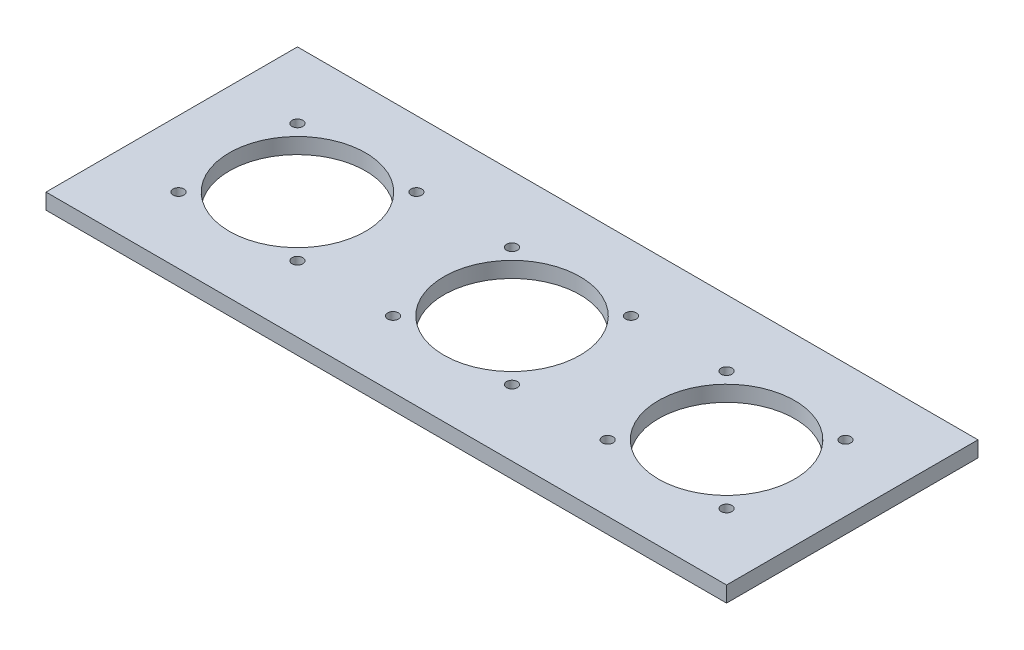
ISO-10303-21;
HEADER;
FILE_DESCRIPTION(('STEP AP214'),'2;1');
FILE_NAME('part.step','',(''),(''),'','','');
FILE_SCHEMA(('AUTOMOTIVE_DESIGN { 1 0 10303 214 1 1 1 1 }'));
ENDSEC;
DATA;
#1=APPLICATION_CONTEXT('core data for automotive mechanical design processes');
#2=APPLICATION_PROTOCOL_DEFINITION('international standard','automotive_design',2000,#1);
#3=PRODUCT_CONTEXT('',#1,'mechanical');
#4=PRODUCT('Part','Part','',(#3));
#5=PRODUCT_RELATED_PRODUCT_CATEGORY('part','',(#4));
#6=PRODUCT_DEFINITION_FORMATION('','',#4);
#7=PRODUCT_DEFINITION_CONTEXT('part definition',#1,'design');
#8=PRODUCT_DEFINITION('design','',#6,#7);
#9=PRODUCT_DEFINITION_SHAPE('','',#8);
#10=(LENGTH_UNIT() NAMED_UNIT(*) SI_UNIT(.MILLI.,.METRE.));
#11=(NAMED_UNIT(*) PLANE_ANGLE_UNIT() SI_UNIT($,.RADIAN.));
#12=(NAMED_UNIT(*) SI_UNIT($,.STERADIAN.) SOLID_ANGLE_UNIT());
#13=UNCERTAINTY_MEASURE_WITH_UNIT(LENGTH_MEASURE(1.E-05),#10,'distance_accuracy_value','');
#14=(GEOMETRIC_REPRESENTATION_CONTEXT(3) GLOBAL_UNCERTAINTY_ASSIGNED_CONTEXT((#13)) GLOBAL_UNIT_ASSIGNED_CONTEXT((#10,
#11,#12)) REPRESENTATION_CONTEXT('',''));
#15=CARTESIAN_POINT('',(0.,0.,0.));
#16=DIRECTION('',(0.,0.,1.));
#17=DIRECTION('',(1.,0.,0.));
#18=AXIS2_PLACEMENT_3D('',#15,#16,#17);
#19=CARTESIAN_POINT('',(206.248,4.7625,76.2));
#20=DIRECTION('',(-1.,0.,0.));
#21=DIRECTION('',(0.,0.,1.));
#22=AXIS2_PLACEMENT_3D('',#19,#20,#21);
#23=PLANE('',#22);
#24=DIRECTION('',(0.,0.,-1.));
#25=VECTOR('',#24,1.);
#26=CARTESIAN_POINT('',(206.248,-4.7625,76.2));
#27=LINE('',#26,#25);
#28=CARTESIAN_POINT('',(206.248,-4.7625,76.2));
#29=VERTEX_POINT('',#28);
#30=CARTESIAN_POINT('',(206.248,-4.7625,-76.2));
#31=VERTEX_POINT('',#30);
#32=EDGE_CURVE('E104',#29,#31,#27,.T.);
#33=ORIENTED_EDGE('',*,*,#32,.T.);
#34=DIRECTION('',(0.,-1.,0.));
#35=VECTOR('',#34,1.);
#36=CARTESIAN_POINT('',(206.248,4.7625,-76.2));
#37=LINE('',#36,#35);
#38=CARTESIAN_POINT('',(206.248,4.7625,-76.2));
#39=VERTEX_POINT('',#38);
#40=EDGE_CURVE('E11',#39,#31,#37,.T.);
#41=ORIENTED_EDGE('',*,*,#40,.F.);
#42=DIRECTION('',(0.,0.,-1.));
#43=VECTOR('',#42,1.);
#44=CARTESIAN_POINT('',(206.248,4.7625,76.2));
#45=LINE('',#44,#43);
#46=CARTESIAN_POINT('',(206.248,4.7625,76.2));
#47=VERTEX_POINT('',#46);
#48=EDGE_CURVE('E92',#47,#39,#45,.T.);
#49=ORIENTED_EDGE('',*,*,#48,.F.);
#50=DIRECTION('',(0.,-1.,0.));
#51=VECTOR('',#50,1.);
#52=CARTESIAN_POINT('',(206.248,4.7625,76.2));
#53=LINE('',#52,#51);
#54=EDGE_CURVE('E100',#47,#29,#53,.T.);
#55=ORIENTED_EDGE('',*,*,#54,.T.);
#56=EDGE_LOOP('',(#33,#41,#49,#55));
#57=FACE_BOUND('',#56,.T.);
#58=ADVANCED_FACE('F41',(#57),#23,.F.);
#59=CARTESIAN_POINT('',(-206.248,4.7625,-76.2));
#60=DIRECTION('',(0.,0.,1.));
#61=DIRECTION('',(1.,0.,0.));
#62=AXIS2_PLACEMENT_3D('',#59,#60,#61);
#63=PLANE('',#62);
#64=DIRECTION('',(-1.,0.,0.));
#65=VECTOR('',#64,1.);
#66=CARTESIAN_POINT('',(-206.248,-4.7625,-76.2));
#67=LINE('',#66,#65);
#68=CARTESIAN_POINT('',(-206.248,-4.7625,-76.2));
#69=VERTEX_POINT('',#68);
#70=EDGE_CURVE('E96',#31,#69,#67,.T.);
#71=ORIENTED_EDGE('',*,*,#70,.T.);
#72=DIRECTION('',(0.,-1.,0.));
#73=VECTOR('',#72,1.);
#74=CARTESIAN_POINT('',(-206.248,4.7625,-76.2));
#75=LINE('',#74,#73);
#76=CARTESIAN_POINT('',(-206.248,4.7625,-76.2));
#77=VERTEX_POINT('',#76);
#78=EDGE_CURVE('E49',#77,#69,#75,.T.);
#79=ORIENTED_EDGE('',*,*,#78,.F.);
#80=DIRECTION('',(-1.,0.,0.));
#81=VECTOR('',#80,1.);
#82=CARTESIAN_POINT('',(-206.248,4.7625,-76.2));
#83=LINE('',#82,#81);
#84=EDGE_CURVE('E87',#39,#77,#83,.T.);
#85=ORIENTED_EDGE('',*,*,#84,.F.);
#86=ORIENTED_EDGE('',*,*,#40,.T.);
#87=EDGE_LOOP('',(#71,#79,#85,#86));
#88=FACE_BOUND('',#87,.T.);
#89=ADVANCED_FACE('F95',(#88),#63,.F.);
#90=CARTESIAN_POINT('',(-206.248,4.7625,76.2));
#91=DIRECTION('',(1.,0.,0.));
#92=DIRECTION('',(0.,0.,-1.));
#93=AXIS2_PLACEMENT_3D('',#90,#91,#92);
#94=PLANE('',#93);
#95=DIRECTION('',(0.,0.,1.));
#96=VECTOR('',#95,1.);
#97=CARTESIAN_POINT('',(-206.248,-4.7625,76.2));
#98=LINE('',#97,#96);
#99=CARTESIAN_POINT('',(-206.248,-4.7625,76.2));
#100=VERTEX_POINT('',#99);
#101=EDGE_CURVE('E74',#69,#100,#98,.T.);
#102=ORIENTED_EDGE('',*,*,#101,.T.);
#103=DIRECTION('',(0.,-1.,0.));
#104=VECTOR('',#103,1.);
#105=CARTESIAN_POINT('',(-206.248,4.7625,76.2));
#106=LINE('',#105,#104);
#107=CARTESIAN_POINT('',(-206.248,4.7625,76.2));
#108=VERTEX_POINT('',#107);
#109=EDGE_CURVE('E97',#108,#100,#106,.T.);
#110=ORIENTED_EDGE('',*,*,#109,.F.);
#111=DIRECTION('',(0.,0.,1.));
#112=VECTOR('',#111,1.);
#113=CARTESIAN_POINT('',(-206.248,4.7625,76.2));
#114=LINE('',#113,#112);
#115=EDGE_CURVE('E90',#77,#108,#114,.T.);
#116=ORIENTED_EDGE('',*,*,#115,.F.);
#117=ORIENTED_EDGE('',*,*,#78,.T.);
#118=EDGE_LOOP('',(#102,#110,#116,#117));
#119=FACE_BOUND('',#118,.T.);
#120=ADVANCED_FACE('F98',(#119),#94,.F.);
#121=CARTESIAN_POINT('',(-206.248,4.7625,76.2));
#122=DIRECTION('',(0.,0.,-1.));
#123=DIRECTION('',(-1.,0.,0.));
#124=AXIS2_PLACEMENT_3D('',#121,#122,#123);
#125=PLANE('',#124);
#126=DIRECTION('',(1.,0.,0.));
#127=VECTOR('',#126,1.);
#128=CARTESIAN_POINT('',(-206.248,-4.7625,76.2));
#129=LINE('',#128,#127);
#130=EDGE_CURVE('E80',#100,#29,#129,.T.);
#131=ORIENTED_EDGE('',*,*,#130,.T.);
#132=ORIENTED_EDGE('',*,*,#54,.F.);
#133=DIRECTION('',(1.,0.,0.));
#134=VECTOR('',#133,1.);
#135=CARTESIAN_POINT('',(-206.248,4.7625,76.2));
#136=LINE('',#135,#134);
#137=EDGE_CURVE('E57',#108,#47,#136,.T.);
#138=ORIENTED_EDGE('',*,*,#137,.F.);
#139=ORIENTED_EDGE('',*,*,#109,.T.);
#140=EDGE_LOOP('',(#131,#132,#138,#139));
#141=FACE_BOUND('',#140,.T.);
#142=ADVANCED_FACE('F112',(#141),#125,.F.);
#143=CARTESIAN_POINT('',(0.,4.7625,0.));
#144=DIRECTION('',(0.,-1.,0.));
#145=DIRECTION('',(0.,0.,-1.));
#146=AXIS2_PLACEMENT_3D('',#143,#144,#145);
#147=PLANE('',#146);
#148=CARTESIAN_POINT('',(94.0054,4.7625,36.0426));
#149=DIRECTION('',(0.,1.,0.));
#150=DIRECTION('',(0.,0.,1.));
#151=AXIS2_PLACEMENT_3D('',#148,#149,#150);
#152=CIRCLE('',#151,3.26389999999999);
#153=CARTESIAN_POINT('',(94.0054,4.7625,39.3065));
#154=VERTEX_POINT('',#153);
#155=EDGE_CURVE('E204',#154,#154,#152,.T.);
#156=ORIENTED_EDGE('',*,*,#155,.F.);
#157=EDGE_LOOP('',(#156));
#158=FACE_BOUND('',#157,.T.);
#159=CARTESIAN_POINT('',(166.0906,4.7625,36.0426));
#160=DIRECTION('',(0.,1.,0.));
#161=DIRECTION('',(0.,0.,1.));
#162=AXIS2_PLACEMENT_3D('',#159,#160,#161);
#163=CIRCLE('',#162,3.26389999999999);
#164=CARTESIAN_POINT('',(166.0906,4.7625,39.3065));
#165=VERTEX_POINT('',#164);
#166=EDGE_CURVE('E198',#165,#165,#163,.T.);
#167=ORIENTED_EDGE('',*,*,#166,.F.);
#168=EDGE_LOOP('',(#167));
#169=FACE_BOUND('',#168,.T.);
#170=CARTESIAN_POINT('',(94.0054,4.7625,-36.0426));
#171=DIRECTION('',(0.,1.,0.));
#172=DIRECTION('',(0.,0.,1.));
#173=AXIS2_PLACEMENT_3D('',#170,#171,#172);
#174=CIRCLE('',#173,3.26389999999999);
#175=CARTESIAN_POINT('',(94.0054,4.7625,-32.7787));
#176=VERTEX_POINT('',#175);
#177=EDGE_CURVE('E192',#176,#176,#174,.T.);
#178=ORIENTED_EDGE('',*,*,#177,.F.);
#179=EDGE_LOOP('',(#178));
#180=FACE_BOUND('',#179,.T.);
#181=CARTESIAN_POINT('',(166.0906,4.7625,-36.0426));
#182=DIRECTION('',(0.,1.,0.));
#183=DIRECTION('',(0.,0.,1.));
#184=AXIS2_PLACEMENT_3D('',#181,#182,#183);
#185=CIRCLE('',#184,3.26389999999999);
#186=CARTESIAN_POINT('',(166.0906,4.7625,-32.7787));
#187=VERTEX_POINT('',#186);
#188=EDGE_CURVE('E186',#187,#187,#185,.T.);
#189=ORIENTED_EDGE('',*,*,#188,.F.);
#190=EDGE_LOOP('',(#189));
#191=FACE_BOUND('',#190,.T.);
#192=CARTESIAN_POINT('',(-36.0426,4.7625,36.0426));
#193=DIRECTION('',(0.,1.,0.));
#194=DIRECTION('',(0.,0.,1.));
#195=AXIS2_PLACEMENT_3D('',#192,#193,#194);
#196=CIRCLE('',#195,3.26389999999999);
#197=CARTESIAN_POINT('',(-36.0426,4.7625,39.3065));
#198=VERTEX_POINT('',#197);
#199=EDGE_CURVE('E180',#198,#198,#196,.T.);
#200=ORIENTED_EDGE('',*,*,#199,.F.);
#201=EDGE_LOOP('',(#200));
#202=FACE_BOUND('',#201,.T.);
#203=CARTESIAN_POINT('',(36.0426,4.7625,36.0426));
#204=DIRECTION('',(0.,1.,0.));
#205=DIRECTION('',(0.,0.,1.));
#206=AXIS2_PLACEMENT_3D('',#203,#204,#205);
#207=CIRCLE('',#206,3.26389999999999);
#208=CARTESIAN_POINT('',(36.0426,4.7625,39.3065));
#209=VERTEX_POINT('',#208);
#210=EDGE_CURVE('E174',#209,#209,#207,.T.);
#211=ORIENTED_EDGE('',*,*,#210,.F.);
#212=EDGE_LOOP('',(#211));
#213=FACE_BOUND('',#212,.T.);
#214=CARTESIAN_POINT('',(-36.0426,4.7625,-36.0426));
#215=DIRECTION('',(0.,1.,0.));
#216=DIRECTION('',(0.,0.,1.));
#217=AXIS2_PLACEMENT_3D('',#214,#215,#216);
#218=CIRCLE('',#217,3.26389999999999);
#219=CARTESIAN_POINT('',(-36.0426,4.7625,-32.7787));
#220=VERTEX_POINT('',#219);
#221=EDGE_CURVE('E168',#220,#220,#218,.T.);
#222=ORIENTED_EDGE('',*,*,#221,.F.);
#223=EDGE_LOOP('',(#222));
#224=FACE_BOUND('',#223,.T.);
#225=CARTESIAN_POINT('',(36.0426,4.7625,-36.0426));
#226=DIRECTION('',(0.,1.,0.));
#227=DIRECTION('',(0.,0.,1.));
#228=AXIS2_PLACEMENT_3D('',#225,#226,#227);
#229=CIRCLE('',#228,3.26389999999999);
#230=CARTESIAN_POINT('',(36.0426,4.7625,-32.7787));
#231=VERTEX_POINT('',#230);
#232=EDGE_CURVE('E162',#231,#231,#229,.T.);
#233=ORIENTED_EDGE('',*,*,#232,.F.);
#234=EDGE_LOOP('',(#233));
#235=FACE_BOUND('',#234,.T.);
#236=CARTESIAN_POINT('',(-166.0906,4.7625,36.0426));
#237=DIRECTION('',(0.,1.,0.));
#238=DIRECTION('',(0.,0.,1.));
#239=AXIS2_PLACEMENT_3D('',#236,#237,#238);
#240=CIRCLE('',#239,3.26389999999999);
#241=CARTESIAN_POINT('',(-166.0906,4.7625,39.3065));
#242=VERTEX_POINT('',#241);
#243=EDGE_CURVE('E156',#242,#242,#240,.T.);
#244=ORIENTED_EDGE('',*,*,#243,.F.);
#245=EDGE_LOOP('',(#244));
#246=FACE_BOUND('',#245,.T.);
#247=CARTESIAN_POINT('',(-94.0054,4.7625,36.0426));
#248=DIRECTION('',(0.,1.,0.));
#249=DIRECTION('',(0.,0.,1.));
#250=AXIS2_PLACEMENT_3D('',#247,#248,#249);
#251=CIRCLE('',#250,3.26389999999999);
#252=CARTESIAN_POINT('',(-94.0054,4.7625,39.3065));
#253=VERTEX_POINT('',#252);
#254=EDGE_CURVE('E150',#253,#253,#251,.T.);
#255=ORIENTED_EDGE('',*,*,#254,.F.);
#256=EDGE_LOOP('',(#255));
#257=FACE_BOUND('',#256,.T.);
#258=CARTESIAN_POINT('',(-166.0906,4.7625,-36.0426));
#259=DIRECTION('',(0.,1.,0.));
#260=DIRECTION('',(0.,0.,1.));
#261=AXIS2_PLACEMENT_3D('',#258,#259,#260);
#262=CIRCLE('',#261,3.26389999999999);
#263=CARTESIAN_POINT('',(-166.0906,4.7625,-32.7787));
#264=VERTEX_POINT('',#263);
#265=EDGE_CURVE('E144',#264,#264,#262,.T.);
#266=ORIENTED_EDGE('',*,*,#265,.F.);
#267=EDGE_LOOP('',(#266));
#268=FACE_BOUND('',#267,.T.);
#269=CARTESIAN_POINT('',(-94.0054,4.7625,-36.0426));
#270=DIRECTION('',(0.,1.,0.));
#271=DIRECTION('',(0.,0.,1.));
#272=AXIS2_PLACEMENT_3D('',#269,#270,#271);
#273=CIRCLE('',#272,3.26389999999999);
#274=CARTESIAN_POINT('',(-94.0054,4.7625,-32.7787));
#275=VERTEX_POINT('',#274);
#276=EDGE_CURVE('E138',#275,#275,#273,.T.);
#277=ORIENTED_EDGE('',*,*,#276,.F.);
#278=EDGE_LOOP('',(#277));
#279=FACE_BOUND('',#278,.T.);
#280=CARTESIAN_POINT('',(-130.048,4.7625,0.));
#281=DIRECTION('',(0.,1.,0.));
#282=DIRECTION('',(0.,0.,1.));
#283=AXIS2_PLACEMENT_3D('',#280,#281,#282);
#284=CIRCLE('',#283,41.275);
#285=CARTESIAN_POINT('',(-130.048,4.7625,41.275));
#286=VERTEX_POINT('',#285);
#287=EDGE_CURVE('E131',#286,#286,#284,.T.);
#288=ORIENTED_EDGE('',*,*,#287,.F.);
#289=EDGE_LOOP('',(#288));
#290=FACE_BOUND('',#289,.T.);
#291=CARTESIAN_POINT('',(0.,4.7625,0.));
#292=DIRECTION('',(0.,1.,0.));
#293=DIRECTION('',(0.,0.,1.));
#294=AXIS2_PLACEMENT_3D('',#291,#292,#293);
#295=CIRCLE('',#294,41.275);
#296=CARTESIAN_POINT('',(0.,4.7625,41.275));
#297=VERTEX_POINT('',#296);
#298=EDGE_CURVE('E128',#297,#297,#295,.T.);
#299=ORIENTED_EDGE('',*,*,#298,.F.);
#300=EDGE_LOOP('',(#299));
#301=FACE_BOUND('',#300,.T.);
#302=CARTESIAN_POINT('',(130.048,4.7625,0.));
#303=DIRECTION('',(0.,1.,0.));
#304=DIRECTION('',(0.,0.,1.));
#305=AXIS2_PLACEMENT_3D('',#302,#303,#304);
#306=CIRCLE('',#305,41.275);
#307=CARTESIAN_POINT('',(130.048,4.7625,41.275));
#308=VERTEX_POINT('',#307);
#309=EDGE_CURVE('E121',#308,#308,#306,.T.);
#310=ORIENTED_EDGE('',*,*,#309,.F.);
#311=EDGE_LOOP('',(#310));
#312=FACE_BOUND('',#311,.T.);
#313=ORIENTED_EDGE('',*,*,#48,.T.);
#314=ORIENTED_EDGE('',*,*,#84,.T.);
#315=ORIENTED_EDGE('',*,*,#115,.T.);
#316=ORIENTED_EDGE('',*,*,#137,.T.);
#317=EDGE_LOOP('',(#313,#314,#315,#316));
#318=FACE_BOUND('',#317,.T.);
#319=ADVANCED_FACE('F88',(#158,#169,#180,#191,#202,#213,#224,#235,#246,#257,#268,#279,#290,#301,
#312,#318),#147,.F.);
#320=CARTESIAN_POINT('',(0.,-4.7625,0.));
#321=DIRECTION('',(0.,-1.,0.));
#322=DIRECTION('',(0.,0.,-1.));
#323=AXIS2_PLACEMENT_3D('',#320,#321,#322);
#324=PLANE('',#323);
#325=CARTESIAN_POINT('',(94.0054,-4.76250000000001,36.0426));
#326=DIRECTION('',(0.,1.,0.));
#327=DIRECTION('',(0.,0.,1.));
#328=AXIS2_PLACEMENT_3D('',#325,#326,#327);
#329=CIRCLE('',#328,3.26389999999999);
#330=CARTESIAN_POINT('',(94.0054,-4.76250000000001,39.3065));
#331=VERTEX_POINT('',#330);
#332=EDGE_CURVE('E201',#331,#331,#329,.T.);
#333=ORIENTED_EDGE('',*,*,#332,.T.);
#334=EDGE_LOOP('',(#333));
#335=FACE_BOUND('',#334,.T.);
#336=CARTESIAN_POINT('',(166.0906,-4.76250000000001,36.0426));
#337=DIRECTION('',(0.,1.,0.));
#338=DIRECTION('',(0.,0.,1.));
#339=AXIS2_PLACEMENT_3D('',#336,#337,#338);
#340=CIRCLE('',#339,3.26389999999999);
#341=CARTESIAN_POINT('',(166.0906,-4.76250000000001,39.3065));
#342=VERTEX_POINT('',#341);
#343=EDGE_CURVE('E195',#342,#342,#340,.T.);
#344=ORIENTED_EDGE('',*,*,#343,.T.);
#345=EDGE_LOOP('',(#344));
#346=FACE_BOUND('',#345,.T.);
#347=CARTESIAN_POINT('',(94.0054,-4.76250000000001,-36.0426));
#348=DIRECTION('',(0.,1.,0.));
#349=DIRECTION('',(0.,0.,1.));
#350=AXIS2_PLACEMENT_3D('',#347,#348,#349);
#351=CIRCLE('',#350,3.26389999999999);
#352=CARTESIAN_POINT('',(94.0054,-4.76250000000001,-32.7787));
#353=VERTEX_POINT('',#352);
#354=EDGE_CURVE('E189',#353,#353,#351,.T.);
#355=ORIENTED_EDGE('',*,*,#354,.T.);
#356=EDGE_LOOP('',(#355));
#357=FACE_BOUND('',#356,.T.);
#358=CARTESIAN_POINT('',(166.0906,-4.76250000000001,-36.0426));
#359=DIRECTION('',(0.,1.,0.));
#360=DIRECTION('',(0.,0.,1.));
#361=AXIS2_PLACEMENT_3D('',#358,#359,#360);
#362=CIRCLE('',#361,3.26389999999999);
#363=CARTESIAN_POINT('',(166.0906,-4.76250000000001,-32.7787));
#364=VERTEX_POINT('',#363);
#365=EDGE_CURVE('E183',#364,#364,#362,.T.);
#366=ORIENTED_EDGE('',*,*,#365,.T.);
#367=EDGE_LOOP('',(#366));
#368=FACE_BOUND('',#367,.T.);
#369=CARTESIAN_POINT('',(-36.0426,-4.76250000000001,36.0426));
#370=DIRECTION('',(0.,1.,0.));
#371=DIRECTION('',(0.,0.,1.));
#372=AXIS2_PLACEMENT_3D('',#369,#370,#371);
#373=CIRCLE('',#372,3.26389999999999);
#374=CARTESIAN_POINT('',(-36.0426,-4.76250000000001,39.3065));
#375=VERTEX_POINT('',#374);
#376=EDGE_CURVE('E177',#375,#375,#373,.T.);
#377=ORIENTED_EDGE('',*,*,#376,.T.);
#378=EDGE_LOOP('',(#377));
#379=FACE_BOUND('',#378,.T.);
#380=CARTESIAN_POINT('',(36.0426,-4.76250000000001,36.0426));
#381=DIRECTION('',(0.,1.,0.));
#382=DIRECTION('',(0.,0.,1.));
#383=AXIS2_PLACEMENT_3D('',#380,#381,#382);
#384=CIRCLE('',#383,3.26389999999999);
#385=CARTESIAN_POINT('',(36.0426,-4.76250000000001,39.3065));
#386=VERTEX_POINT('',#385);
#387=EDGE_CURVE('E171',#386,#386,#384,.T.);
#388=ORIENTED_EDGE('',*,*,#387,.T.);
#389=EDGE_LOOP('',(#388));
#390=FACE_BOUND('',#389,.T.);
#391=CARTESIAN_POINT('',(-36.0426,-4.76250000000001,-36.0426));
#392=DIRECTION('',(0.,1.,0.));
#393=DIRECTION('',(0.,0.,1.));
#394=AXIS2_PLACEMENT_3D('',#391,#392,#393);
#395=CIRCLE('',#394,3.26389999999999);
#396=CARTESIAN_POINT('',(-36.0426,-4.76250000000001,-32.7787));
#397=VERTEX_POINT('',#396);
#398=EDGE_CURVE('E165',#397,#397,#395,.T.);
#399=ORIENTED_EDGE('',*,*,#398,.T.);
#400=EDGE_LOOP('',(#399));
#401=FACE_BOUND('',#400,.T.);
#402=CARTESIAN_POINT('',(36.0426,-4.76250000000001,-36.0426));
#403=DIRECTION('',(0.,1.,0.));
#404=DIRECTION('',(0.,0.,1.));
#405=AXIS2_PLACEMENT_3D('',#402,#403,#404);
#406=CIRCLE('',#405,3.26389999999999);
#407=CARTESIAN_POINT('',(36.0426,-4.76250000000001,-32.7787));
#408=VERTEX_POINT('',#407);
#409=EDGE_CURVE('E159',#408,#408,#406,.T.);
#410=ORIENTED_EDGE('',*,*,#409,.T.);
#411=EDGE_LOOP('',(#410));
#412=FACE_BOUND('',#411,.T.);
#413=CARTESIAN_POINT('',(-166.0906,-4.76250000000001,36.0426));
#414=DIRECTION('',(0.,1.,0.));
#415=DIRECTION('',(0.,0.,1.));
#416=AXIS2_PLACEMENT_3D('',#413,#414,#415);
#417=CIRCLE('',#416,3.26389999999999);
#418=CARTESIAN_POINT('',(-166.0906,-4.76250000000001,39.3065));
#419=VERTEX_POINT('',#418);
#420=EDGE_CURVE('E153',#419,#419,#417,.T.);
#421=ORIENTED_EDGE('',*,*,#420,.T.);
#422=EDGE_LOOP('',(#421));
#423=FACE_BOUND('',#422,.T.);
#424=CARTESIAN_POINT('',(-94.0054,-4.76250000000001,36.0426));
#425=DIRECTION('',(0.,1.,0.));
#426=DIRECTION('',(0.,0.,1.));
#427=AXIS2_PLACEMENT_3D('',#424,#425,#426);
#428=CIRCLE('',#427,3.26389999999999);
#429=CARTESIAN_POINT('',(-94.0054,-4.76250000000001,39.3065));
#430=VERTEX_POINT('',#429);
#431=EDGE_CURVE('E147',#430,#430,#428,.T.);
#432=ORIENTED_EDGE('',*,*,#431,.T.);
#433=EDGE_LOOP('',(#432));
#434=FACE_BOUND('',#433,.T.);
#435=CARTESIAN_POINT('',(-166.0906,-4.76250000000001,-36.0426));
#436=DIRECTION('',(0.,1.,0.));
#437=DIRECTION('',(0.,0.,1.));
#438=AXIS2_PLACEMENT_3D('',#435,#436,#437);
#439=CIRCLE('',#438,3.26389999999999);
#440=CARTESIAN_POINT('',(-166.0906,-4.76250000000001,-32.7787));
#441=VERTEX_POINT('',#440);
#442=EDGE_CURVE('E141',#441,#441,#439,.T.);
#443=ORIENTED_EDGE('',*,*,#442,.T.);
#444=EDGE_LOOP('',(#443));
#445=FACE_BOUND('',#444,.T.);
#446=CARTESIAN_POINT('',(-94.0054,-4.76250000000001,-36.0426));
#447=DIRECTION('',(0.,1.,0.));
#448=DIRECTION('',(0.,0.,1.));
#449=AXIS2_PLACEMENT_3D('',#446,#447,#448);
#450=CIRCLE('',#449,3.26389999999999);
#451=CARTESIAN_POINT('',(-94.0054,-4.76250000000001,-32.7787));
#452=VERTEX_POINT('',#451);
#453=EDGE_CURVE('E122',#452,#452,#450,.T.);
#454=ORIENTED_EDGE('',*,*,#453,.T.);
#455=EDGE_LOOP('',(#454));
#456=FACE_BOUND('',#455,.T.);
#457=CARTESIAN_POINT('',(-130.048,-4.7625,0.));
#458=DIRECTION('',(0.,1.,0.));
#459=DIRECTION('',(0.,0.,1.));
#460=AXIS2_PLACEMENT_3D('',#457,#458,#459);
#461=CIRCLE('',#460,41.275);
#462=CARTESIAN_POINT('',(-130.048,-4.7625,41.275));
#463=VERTEX_POINT('',#462);
#464=EDGE_CURVE('E107',#463,#463,#461,.T.);
#465=ORIENTED_EDGE('',*,*,#464,.T.);
#466=EDGE_LOOP('',(#465));
#467=FACE_BOUND('',#466,.T.);
#468=CARTESIAN_POINT('',(0.,-4.7625,0.));
#469=DIRECTION('',(0.,1.,0.));
#470=DIRECTION('',(0.,0.,1.));
#471=AXIS2_PLACEMENT_3D('',#468,#469,#470);
#472=CIRCLE('',#471,41.275);
#473=CARTESIAN_POINT('',(0.,-4.7625,41.275));
#474=VERTEX_POINT('',#473);
#475=EDGE_CURVE('E125',#474,#474,#472,.T.);
#476=ORIENTED_EDGE('',*,*,#475,.T.);
#477=EDGE_LOOP('',(#476));
#478=FACE_BOUND('',#477,.T.);
#479=CARTESIAN_POINT('',(130.048,-4.7625,0.));
#480=DIRECTION('',(0.,1.,0.));
#481=DIRECTION('',(0.,0.,1.));
#482=AXIS2_PLACEMENT_3D('',#479,#480,#481);
#483=CIRCLE('',#482,41.275);
#484=CARTESIAN_POINT('',(130.048,-4.7625,41.275));
#485=VERTEX_POINT('',#484);
#486=EDGE_CURVE('E118',#485,#485,#483,.T.);
#487=ORIENTED_EDGE('',*,*,#486,.T.);
#488=EDGE_LOOP('',(#487));
#489=FACE_BOUND('',#488,.T.);
#490=ORIENTED_EDGE('',*,*,#32,.F.);
#491=ORIENTED_EDGE('',*,*,#130,.F.);
#492=ORIENTED_EDGE('',*,*,#101,.F.);
#493=ORIENTED_EDGE('',*,*,#70,.F.);
#494=EDGE_LOOP('',(#490,#491,#492,#493));
#495=FACE_BOUND('',#494,.T.);
#496=ADVANCED_FACE('F115',(#335,#346,#357,#368,#379,#390,#401,#412,#423,#434,#445,#456,#467,
#478,#489,#495),#324,.T.);
#497=CARTESIAN_POINT('',(130.048,-4.7625,0.));
#498=DIRECTION('',(0.,1.,0.));
#499=DIRECTION('',(0.,0.,1.));
#500=AXIS2_PLACEMENT_3D('',#497,#498,#499);
#501=CYLINDRICAL_SURFACE('',#500,41.275);
#502=ORIENTED_EDGE('',*,*,#486,.F.);
#503=EDGE_LOOP('',(#502));
#504=FACE_BOUND('',#503,.T.);
#505=ORIENTED_EDGE('',*,*,#309,.T.);
#506=EDGE_LOOP('',(#505));
#507=FACE_BOUND('',#506,.T.);
#508=ADVANCED_FACE('F241',(#504,#507),#501,.F.);
#509=CARTESIAN_POINT('',(0.,-4.7625,0.));
#510=DIRECTION('',(0.,1.,0.));
#511=DIRECTION('',(0.,0.,1.));
#512=AXIS2_PLACEMENT_3D('',#509,#510,#511);
#513=CYLINDRICAL_SURFACE('',#512,41.275);
#514=ORIENTED_EDGE('',*,*,#475,.F.);
#515=EDGE_LOOP('',(#514));
#516=FACE_BOUND('',#515,.T.);
#517=ORIENTED_EDGE('',*,*,#298,.T.);
#518=EDGE_LOOP('',(#517));
#519=FACE_BOUND('',#518,.T.);
#520=ADVANCED_FACE('F243',(#516,#519),#513,.F.);
#521=CARTESIAN_POINT('',(-130.048,-4.7625,0.));
#522=DIRECTION('',(0.,1.,0.));
#523=DIRECTION('',(0.,0.,1.));
#524=AXIS2_PLACEMENT_3D('',#521,#522,#523);
#525=CYLINDRICAL_SURFACE('',#524,41.275);
#526=ORIENTED_EDGE('',*,*,#464,.F.);
#527=EDGE_LOOP('',(#526));
#528=FACE_BOUND('',#527,.T.);
#529=ORIENTED_EDGE('',*,*,#287,.T.);
#530=EDGE_LOOP('',(#529));
#531=FACE_BOUND('',#530,.T.);
#532=ADVANCED_FACE('F250',(#528,#531),#525,.F.);
#533=CARTESIAN_POINT('',(-94.0054,4.7625,-36.0426));
#534=DIRECTION('',(0.,1.,0.));
#535=DIRECTION('',(0.,0.,1.));
#536=AXIS2_PLACEMENT_3D('',#533,#534,#535);
#537=CYLINDRICAL_SURFACE('',#536,3.26389999999999);
#538=ORIENTED_EDGE('',*,*,#453,.F.);
#539=EDGE_LOOP('',(#538));
#540=FACE_BOUND('',#539,.T.);
#541=ORIENTED_EDGE('',*,*,#276,.T.);
#542=EDGE_LOOP('',(#541));
#543=FACE_BOUND('',#542,.T.);
#544=ADVANCED_FACE('F311',(#540,#543),#537,.F.);
#545=CARTESIAN_POINT('',(-166.0906,4.7625,-36.0426));
#546=DIRECTION('',(0.,1.,0.));
#547=DIRECTION('',(0.,0.,1.));
#548=AXIS2_PLACEMENT_3D('',#545,#546,#547);
#549=CYLINDRICAL_SURFACE('',#548,3.26389999999999);
#550=ORIENTED_EDGE('',*,*,#442,.F.);
#551=EDGE_LOOP('',(#550));
#552=FACE_BOUND('',#551,.T.);
#553=ORIENTED_EDGE('',*,*,#265,.T.);
#554=EDGE_LOOP('',(#553));
#555=FACE_BOUND('',#554,.T.);
#556=ADVANCED_FACE('F320',(#552,#555),#549,.F.);
#557=CARTESIAN_POINT('',(-94.0054,4.7625,36.0426));
#558=DIRECTION('',(0.,1.,0.));
#559=DIRECTION('',(0.,0.,1.));
#560=AXIS2_PLACEMENT_3D('',#557,#558,#559);
#561=CYLINDRICAL_SURFACE('',#560,3.26389999999999);
#562=ORIENTED_EDGE('',*,*,#431,.F.);
#563=EDGE_LOOP('',(#562));
#564=FACE_BOUND('',#563,.T.);
#565=ORIENTED_EDGE('',*,*,#254,.T.);
#566=EDGE_LOOP('',(#565));
#567=FACE_BOUND('',#566,.T.);
#568=ADVANCED_FACE('F330',(#564,#567),#561,.F.);
#569=CARTESIAN_POINT('',(-166.0906,4.7625,36.0426));
#570=DIRECTION('',(0.,1.,0.));
#571=DIRECTION('',(0.,0.,1.));
#572=AXIS2_PLACEMENT_3D('',#569,#570,#571);
#573=CYLINDRICAL_SURFACE('',#572,3.26389999999999);
#574=ORIENTED_EDGE('',*,*,#420,.F.);
#575=EDGE_LOOP('',(#574));
#576=FACE_BOUND('',#575,.T.);
#577=ORIENTED_EDGE('',*,*,#243,.T.);
#578=EDGE_LOOP('',(#577));
#579=FACE_BOUND('',#578,.T.);
#580=ADVANCED_FACE('F340',(#576,#579),#573,.F.);
#581=CARTESIAN_POINT('',(36.0426,4.7625,-36.0426));
#582=DIRECTION('',(0.,1.,0.));
#583=DIRECTION('',(0.,0.,1.));
#584=AXIS2_PLACEMENT_3D('',#581,#582,#583);
#585=CYLINDRICAL_SURFACE('',#584,3.26389999999999);
#586=ORIENTED_EDGE('',*,*,#409,.F.);
#587=EDGE_LOOP('',(#586));
#588=FACE_BOUND('',#587,.T.);
#589=ORIENTED_EDGE('',*,*,#232,.T.);
#590=EDGE_LOOP('',(#589));
#591=FACE_BOUND('',#590,.T.);
#592=ADVANCED_FACE('F350',(#588,#591),#585,.F.);
#593=CARTESIAN_POINT('',(-36.0426,4.7625,-36.0426));
#594=DIRECTION('',(0.,1.,0.));
#595=DIRECTION('',(0.,0.,1.));
#596=AXIS2_PLACEMENT_3D('',#593,#594,#595);
#597=CYLINDRICAL_SURFACE('',#596,3.26389999999999);
#598=ORIENTED_EDGE('',*,*,#398,.F.);
#599=EDGE_LOOP('',(#598));
#600=FACE_BOUND('',#599,.T.);
#601=ORIENTED_EDGE('',*,*,#221,.T.);
#602=EDGE_LOOP('',(#601));
#603=FACE_BOUND('',#602,.T.);
#604=ADVANCED_FACE('F360',(#600,#603),#597,.F.);
#605=CARTESIAN_POINT('',(36.0426,4.7625,36.0426));
#606=DIRECTION('',(0.,1.,0.));
#607=DIRECTION('',(0.,0.,1.));
#608=AXIS2_PLACEMENT_3D('',#605,#606,#607);
#609=CYLINDRICAL_SURFACE('',#608,3.26389999999999);
#610=ORIENTED_EDGE('',*,*,#387,.F.);
#611=EDGE_LOOP('',(#610));
#612=FACE_BOUND('',#611,.T.);
#613=ORIENTED_EDGE('',*,*,#210,.T.);
#614=EDGE_LOOP('',(#613));
#615=FACE_BOUND('',#614,.T.);
#616=ADVANCED_FACE('F370',(#612,#615),#609,.F.);
#617=CARTESIAN_POINT('',(-36.0426,4.7625,36.0426));
#618=DIRECTION('',(0.,1.,0.));
#619=DIRECTION('',(0.,0.,1.));
#620=AXIS2_PLACEMENT_3D('',#617,#618,#619);
#621=CYLINDRICAL_SURFACE('',#620,3.26389999999999);
#622=ORIENTED_EDGE('',*,*,#376,.F.);
#623=EDGE_LOOP('',(#622));
#624=FACE_BOUND('',#623,.T.);
#625=ORIENTED_EDGE('',*,*,#199,.T.);
#626=EDGE_LOOP('',(#625));
#627=FACE_BOUND('',#626,.T.);
#628=ADVANCED_FACE('F380',(#624,#627),#621,.F.);
#629=CARTESIAN_POINT('',(166.0906,4.7625,-36.0426));
#630=DIRECTION('',(0.,1.,0.));
#631=DIRECTION('',(0.,0.,1.));
#632=AXIS2_PLACEMENT_3D('',#629,#630,#631);
#633=CYLINDRICAL_SURFACE('',#632,3.26389999999999);
#634=ORIENTED_EDGE('',*,*,#365,.F.);
#635=EDGE_LOOP('',(#634));
#636=FACE_BOUND('',#635,.T.);
#637=ORIENTED_EDGE('',*,*,#188,.T.);
#638=EDGE_LOOP('',(#637));
#639=FACE_BOUND('',#638,.T.);
#640=ADVANCED_FACE('F390',(#636,#639),#633,.F.);
#641=CARTESIAN_POINT('',(94.0054,4.7625,-36.0426));
#642=DIRECTION('',(0.,1.,0.));
#643=DIRECTION('',(0.,0.,1.));
#644=AXIS2_PLACEMENT_3D('',#641,#642,#643);
#645=CYLINDRICAL_SURFACE('',#644,3.26389999999999);
#646=ORIENTED_EDGE('',*,*,#354,.F.);
#647=EDGE_LOOP('',(#646));
#648=FACE_BOUND('',#647,.T.);
#649=ORIENTED_EDGE('',*,*,#177,.T.);
#650=EDGE_LOOP('',(#649));
#651=FACE_BOUND('',#650,.T.);
#652=ADVANCED_FACE('F400',(#648,#651),#645,.F.);
#653=CARTESIAN_POINT('',(166.0906,4.7625,36.0426));
#654=DIRECTION('',(0.,1.,0.));
#655=DIRECTION('',(0.,0.,1.));
#656=AXIS2_PLACEMENT_3D('',#653,#654,#655);
#657=CYLINDRICAL_SURFACE('',#656,3.26389999999999);
#658=ORIENTED_EDGE('',*,*,#343,.F.);
#659=EDGE_LOOP('',(#658));
#660=FACE_BOUND('',#659,.T.);
#661=ORIENTED_EDGE('',*,*,#166,.T.);
#662=EDGE_LOOP('',(#661));
#663=FACE_BOUND('',#662,.T.);
#664=ADVANCED_FACE('F410',(#660,#663),#657,.F.);
#665=CARTESIAN_POINT('',(94.0054,4.7625,36.0426));
#666=DIRECTION('',(0.,1.,0.));
#667=DIRECTION('',(0.,0.,1.));
#668=AXIS2_PLACEMENT_3D('',#665,#666,#667);
#669=CYLINDRICAL_SURFACE('',#668,3.26389999999999);
#670=ORIENTED_EDGE('',*,*,#332,.F.);
#671=EDGE_LOOP('',(#670));
#672=FACE_BOUND('',#671,.T.);
#673=ORIENTED_EDGE('',*,*,#155,.T.);
#674=EDGE_LOOP('',(#673));
#675=FACE_BOUND('',#674,.T.);
#676=ADVANCED_FACE('F208',(#672,#675),#669,.F.);
#677=CLOSED_SHELL('',(#58,#89,#120,#142,#319,#496,#508,#520,#532,#544,#556,#568,#580,#592,#604,
#616,#628,#640,#652,#664,#676));
#678=MANIFOLD_SOLID_BREP('B2',#677);
#679=ADVANCED_BREP_SHAPE_REPRESENTATION('',(#18,#678),#14);
#680=SHAPE_DEFINITION_REPRESENTATION(#9,#679);
ENDSEC;
END-ISO-10303-21;
